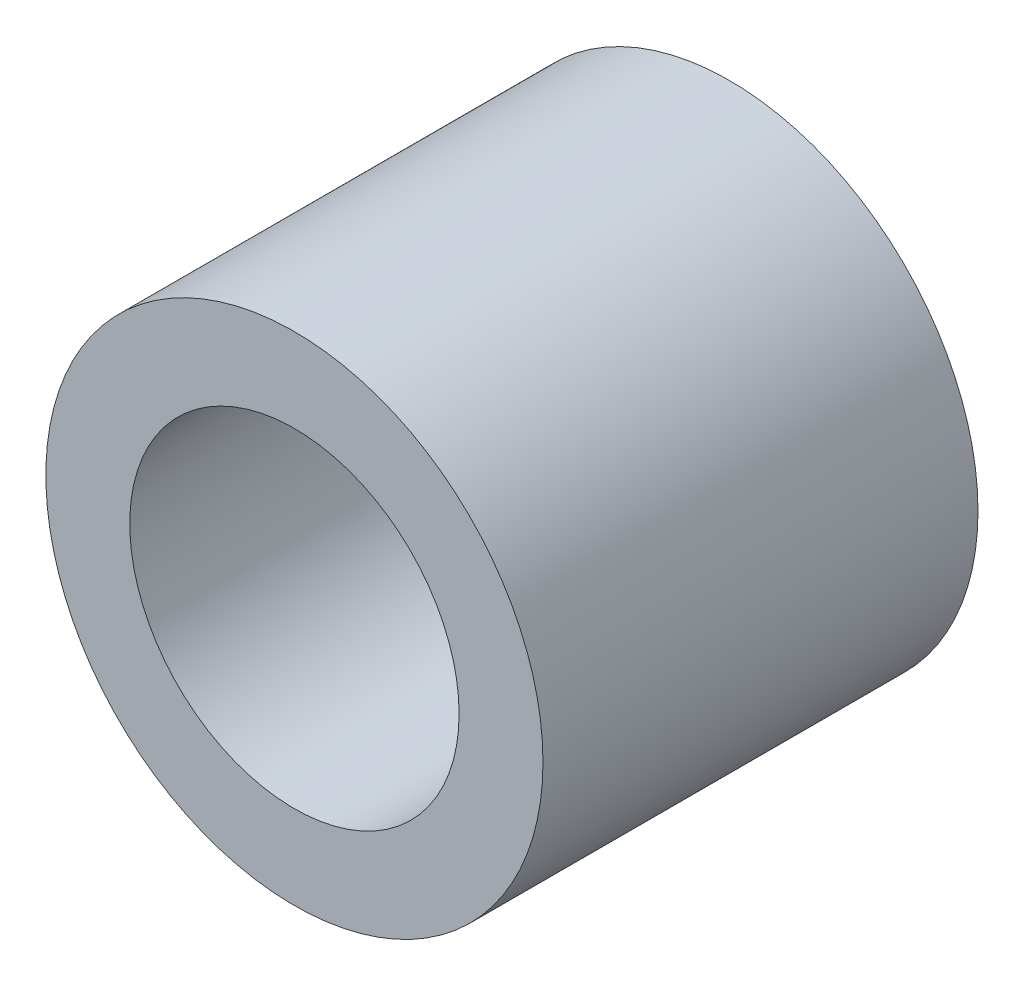
ISO-10303-21;
HEADER;
FILE_DESCRIPTION(('STEP AP214'),'2;1');
FILE_NAME('part.step','',(''),(''),'','','');
FILE_SCHEMA(('AUTOMOTIVE_DESIGN { 1 0 10303 214 1 1 1 1 }'));
ENDSEC;
DATA;
#1=APPLICATION_CONTEXT('core data for automotive mechanical design processes');
#2=APPLICATION_PROTOCOL_DEFINITION('international standard','automotive_design',2000,#1);
#3=PRODUCT_CONTEXT('',#1,'mechanical');
#4=PRODUCT('Part','Part','',(#3));
#5=PRODUCT_RELATED_PRODUCT_CATEGORY('part','',(#4));
#6=PRODUCT_DEFINITION_FORMATION('','',#4);
#7=PRODUCT_DEFINITION_CONTEXT('part definition',#1,'design');
#8=PRODUCT_DEFINITION('design','',#6,#7);
#9=PRODUCT_DEFINITION_SHAPE('','',#8);
#10=(LENGTH_UNIT() NAMED_UNIT(*) SI_UNIT(.MILLI.,.METRE.));
#11=(NAMED_UNIT(*) PLANE_ANGLE_UNIT() SI_UNIT($,.RADIAN.));
#12=(NAMED_UNIT(*) SI_UNIT($,.STERADIAN.) SOLID_ANGLE_UNIT());
#13=UNCERTAINTY_MEASURE_WITH_UNIT(LENGTH_MEASURE(1.E-05),#10,'distance_accuracy_value','');
#14=(GEOMETRIC_REPRESENTATION_CONTEXT(3) GLOBAL_UNCERTAINTY_ASSIGNED_CONTEXT((#13)) GLOBAL_UNIT_ASSIGNED_CONTEXT((#10,
#11,#12)) REPRESENTATION_CONTEXT('',''));
#15=CARTESIAN_POINT('',(0.,0.,0.));
#16=DIRECTION('',(0.,0.,1.));
#17=DIRECTION('',(1.,0.,0.));
#18=AXIS2_PLACEMENT_3D('',#15,#16,#17);
#19=CARTESIAN_POINT('',(0.,0.,7.));
#20=DIRECTION('',(0.,0.,-1.));
#21=DIRECTION('',(-1.,0.,0.));
#22=AXIS2_PLACEMENT_3D('',#19,#20,#21);
#23=CYLINDRICAL_SURFACE('',#22,4.);
#24=CARTESIAN_POINT('',(0.,0.,7.));
#25=DIRECTION('',(0.,0.,1.));
#26=DIRECTION('',(1.,0.,0.));
#27=AXIS2_PLACEMENT_3D('',#24,#25,#26);
#28=CIRCLE('',#27,4.);
#29=CARTESIAN_POINT('',(4.,0.,7.));
#30=VERTEX_POINT('',#29);
#31=EDGE_CURVE('E10',#30,#30,#28,.T.);
#32=ORIENTED_EDGE('',*,*,#31,.F.);
#33=EDGE_LOOP('',(#32));
#34=FACE_BOUND('',#33,.T.);
#35=CARTESIAN_POINT('',(0.,0.,0.));
#36=DIRECTION('',(0.,0.,1.));
#37=DIRECTION('',(1.,0.,0.));
#38=AXIS2_PLACEMENT_3D('',#35,#36,#37);
#39=CIRCLE('',#38,4.);
#40=CARTESIAN_POINT('',(4.,0.,0.));
#41=VERTEX_POINT('',#40);
#42=EDGE_CURVE('E43',#41,#41,#39,.T.);
#43=ORIENTED_EDGE('',*,*,#42,.T.);
#44=EDGE_LOOP('',(#43));
#45=FACE_BOUND('',#44,.T.);
#46=ADVANCED_FACE('F40',(#34,#45),#23,.T.);
#47=CARTESIAN_POINT('',(0.,0.,7.));
#48=DIRECTION('',(0.,0.,1.));
#49=DIRECTION('',(1.,0.,0.));
#50=AXIS2_PLACEMENT_3D('',#47,#48,#49);
#51=PLANE('',#50);
#52=CARTESIAN_POINT('',(0.,0.,7.));
#53=DIRECTION('',(0.,0.,1.));
#54=DIRECTION('',(1.,0.,0.));
#55=AXIS2_PLACEMENT_3D('',#52,#53,#54);
#56=CIRCLE('',#55,2.65);
#57=CARTESIAN_POINT('',(2.65,0.,7.));
#58=VERTEX_POINT('',#57);
#59=EDGE_CURVE('E57',#58,#58,#56,.T.);
#60=ORIENTED_EDGE('',*,*,#59,.F.);
#61=EDGE_LOOP('',(#60));
#62=FACE_BOUND('',#61,.T.);
#63=ORIENTED_EDGE('',*,*,#31,.T.);
#64=EDGE_LOOP('',(#63));
#65=FACE_BOUND('',#64,.T.);
#66=ADVANCED_FACE('F65',(#62,#65),#51,.T.);
#67=CARTESIAN_POINT('',(0.,0.,0.));
#68=DIRECTION('',(0.,0.,1.));
#69=DIRECTION('',(1.,0.,0.));
#70=AXIS2_PLACEMENT_3D('',#67,#68,#69);
#71=PLANE('',#70);
#72=CARTESIAN_POINT('',(0.,0.,0.));
#73=DIRECTION('',(0.,0.,1.));
#74=DIRECTION('',(1.,0.,0.));
#75=AXIS2_PLACEMENT_3D('',#72,#73,#74);
#76=CIRCLE('',#75,2.65);
#77=CARTESIAN_POINT('',(2.65,0.,0.));
#78=VERTEX_POINT('',#77);
#79=EDGE_CURVE('E52',#78,#78,#76,.F.);
#80=ORIENTED_EDGE('',*,*,#79,.F.);
#81=EDGE_LOOP('',(#80));
#82=FACE_BOUND('',#81,.T.);
#83=ORIENTED_EDGE('',*,*,#42,.F.);
#84=EDGE_LOOP('',(#83));
#85=FACE_BOUND('',#84,.T.);
#86=ADVANCED_FACE('F67',(#82,#85),#71,.F.);
#87=CARTESIAN_POINT('',(0.,0.,-0.00100000000000013));
#88=DIRECTION('',(0.,0.,1.));
#89=DIRECTION('',(1.,0.,0.));
#90=AXIS2_PLACEMENT_3D('',#87,#88,#89);
#91=CYLINDRICAL_SURFACE('',#90,2.65);
#92=ORIENTED_EDGE('',*,*,#59,.T.);
#93=EDGE_LOOP('',(#92));
#94=FACE_BOUND('',#93,.T.);
#95=ORIENTED_EDGE('',*,*,#79,.T.);
#96=EDGE_LOOP('',(#95));
#97=FACE_BOUND('',#96,.T.);
#98=ADVANCED_FACE('F62',(#94,#97),#91,.F.);
#99=CLOSED_SHELL('',(#46,#66,#86,#98));
#100=MANIFOLD_SOLID_BREP('B2',#99);
#101=ADVANCED_BREP_SHAPE_REPRESENTATION('',(#18,#100),#14);
#102=SHAPE_DEFINITION_REPRESENTATION(#9,#101);
ENDSEC;
END-ISO-10303-21;
